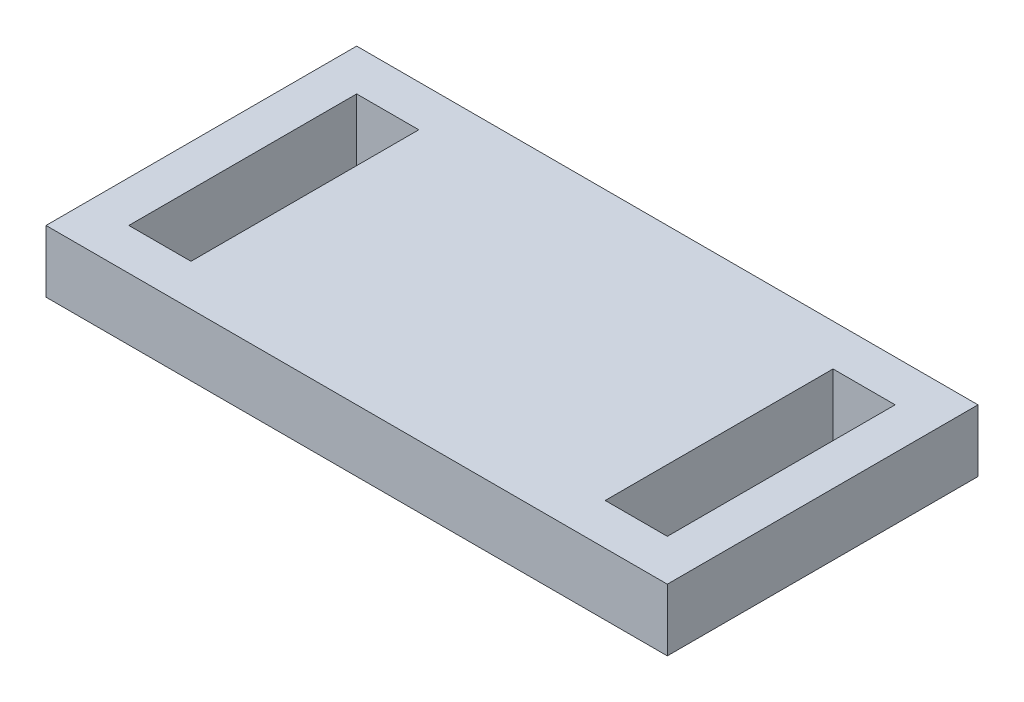
ISO-10303-21;
HEADER;
FILE_DESCRIPTION(('STEP AP214'),'2;1');
FILE_NAME('part.step','',(''),(''),'','','');
FILE_SCHEMA(('AUTOMOTIVE_DESIGN { 1 0 10303 214 1 1 1 1 }'));
ENDSEC;
DATA;
#1=APPLICATION_CONTEXT('core data for automotive mechanical design processes');
#2=APPLICATION_PROTOCOL_DEFINITION('international standard','automotive_design',2000,#1);
#3=PRODUCT_CONTEXT('',#1,'mechanical');
#4=PRODUCT('Part','Part','',(#3));
#5=PRODUCT_RELATED_PRODUCT_CATEGORY('part','',(#4));
#6=PRODUCT_DEFINITION_FORMATION('','',#4);
#7=PRODUCT_DEFINITION_CONTEXT('part definition',#1,'design');
#8=PRODUCT_DEFINITION('design','',#6,#7);
#9=PRODUCT_DEFINITION_SHAPE('','',#8);
#10=(LENGTH_UNIT() NAMED_UNIT(*) SI_UNIT(.MILLI.,.METRE.));
#11=(NAMED_UNIT(*) PLANE_ANGLE_UNIT() SI_UNIT($,.RADIAN.));
#12=(NAMED_UNIT(*) SI_UNIT($,.STERADIAN.) SOLID_ANGLE_UNIT());
#13=UNCERTAINTY_MEASURE_WITH_UNIT(LENGTH_MEASURE(1.E-05),#10,'distance_accuracy_value','');
#14=(GEOMETRIC_REPRESENTATION_CONTEXT(3) GLOBAL_UNCERTAINTY_ASSIGNED_CONTEXT((#13)) GLOBAL_UNIT_ASSIGNED_CONTEXT((#10,
#11,#12)) REPRESENTATION_CONTEXT('',''));
#15=CARTESIAN_POINT('',(0.,0.,0.));
#16=DIRECTION('',(0.,0.,1.));
#17=DIRECTION('',(1.,0.,0.));
#18=AXIS2_PLACEMENT_3D('',#15,#16,#17);
#19=CARTESIAN_POINT('',(15.,3.,-7.49999999999999));
#20=DIRECTION('',(-1.,0.,0.));
#21=DIRECTION('',(0.,0.,1.));
#22=AXIS2_PLACEMENT_3D('',#19,#20,#21);
#23=PLANE('',#22);
#24=DIRECTION('',(0.,0.,-1.));
#25=VECTOR('',#24,1.);
#26=CARTESIAN_POINT('',(15.,0.,-7.49999999999999));
#27=LINE('',#26,#25);
#28=CARTESIAN_POINT('',(15.,0.,7.5));
#29=VERTEX_POINT('',#28);
#30=CARTESIAN_POINT('',(15.,0.,-7.49999999999999));
#31=VERTEX_POINT('',#30);
#32=EDGE_CURVE('E186',#29,#31,#27,.T.);
#33=ORIENTED_EDGE('',*,*,#32,.T.);
#34=DIRECTION('',(0.,-1.,0.));
#35=VECTOR('',#34,1.);
#36=CARTESIAN_POINT('',(15.,3.,-7.49999999999999));
#37=LINE('',#36,#35);
#38=CARTESIAN_POINT('',(15.,3.,-7.49999999999999));
#39=VERTEX_POINT('',#38);
#40=EDGE_CURVE('E11',#39,#31,#37,.T.);
#41=ORIENTED_EDGE('',*,*,#40,.F.);
#42=DIRECTION('',(0.,0.,-1.));
#43=VECTOR('',#42,1.);
#44=CARTESIAN_POINT('',(15.,3.,-7.49999999999999));
#45=LINE('',#44,#43);
#46=CARTESIAN_POINT('',(15.,3.,7.5));
#47=VERTEX_POINT('',#46);
#48=EDGE_CURVE('E192',#47,#39,#45,.T.);
#49=ORIENTED_EDGE('',*,*,#48,.F.);
#50=DIRECTION('',(0.,-1.,0.));
#51=VECTOR('',#50,1.);
#52=CARTESIAN_POINT('',(15.,3.,7.5));
#53=LINE('',#52,#51);
#54=EDGE_CURVE('E204',#47,#29,#53,.T.);
#55=ORIENTED_EDGE('',*,*,#54,.T.);
#56=EDGE_LOOP('',(#33,#41,#49,#55));
#57=FACE_BOUND('',#56,.T.);
#58=ADVANCED_FACE('F36',(#57),#23,.F.);
#59=CARTESIAN_POINT('',(-15.,3.,-7.49999999999999));
#60=DIRECTION('',(0.,0.,1.));
#61=DIRECTION('',(1.,0.,0.));
#62=AXIS2_PLACEMENT_3D('',#59,#60,#61);
#63=PLANE('',#62);
#64=DIRECTION('',(-1.,0.,0.));
#65=VECTOR('',#64,1.);
#66=CARTESIAN_POINT('',(-14.9999999999999,0.,-7.49999999999999));
#67=LINE('',#66,#65);
#68=CARTESIAN_POINT('',(-14.9999999999999,0.,-7.49999999999999));
#69=VERTEX_POINT('',#68);
#70=EDGE_CURVE('E207',#31,#69,#67,.T.);
#71=ORIENTED_EDGE('',*,*,#70,.T.);
#72=DIRECTION('',(0.,-1.,0.));
#73=VECTOR('',#72,1.);
#74=CARTESIAN_POINT('',(-15.,3.,-7.49999999999999));
#75=LINE('',#74,#73);
#76=CARTESIAN_POINT('',(-15.,3.,-7.49999999999999));
#77=VERTEX_POINT('',#76);
#78=EDGE_CURVE('E43',#77,#69,#75,.T.);
#79=ORIENTED_EDGE('',*,*,#78,.F.);
#80=DIRECTION('',(-1.,0.,0.));
#81=VECTOR('',#80,1.);
#82=CARTESIAN_POINT('',(-15.,3.,-7.49999999999999));
#83=LINE('',#82,#81);
#84=EDGE_CURVE('E195',#39,#77,#83,.T.);
#85=ORIENTED_EDGE('',*,*,#84,.F.);
#86=ORIENTED_EDGE('',*,*,#40,.T.);
#87=EDGE_LOOP('',(#71,#79,#85,#86));
#88=FACE_BOUND('',#87,.T.);
#89=ADVANCED_FACE('F224',(#88),#63,.F.);
#90=CARTESIAN_POINT('',(-15.,3.,-7.49999999999999));
#91=DIRECTION('',(1.,0.,0.));
#92=DIRECTION('',(0.,0.,-1.));
#93=AXIS2_PLACEMENT_3D('',#90,#91,#92);
#94=PLANE('',#93);
#95=DIRECTION('',(0.,0.,1.));
#96=VECTOR('',#95,1.);
#97=CARTESIAN_POINT('',(-14.9999999999999,0.,-7.49999999999999));
#98=LINE('',#97,#96);
#99=CARTESIAN_POINT('',(-15.,0.,7.50000000000001));
#100=VERTEX_POINT('',#99);
#101=EDGE_CURVE('E210',#69,#100,#98,.T.);
#102=ORIENTED_EDGE('',*,*,#101,.T.);
#103=DIRECTION('',(0.,-1.,0.));
#104=VECTOR('',#103,1.);
#105=CARTESIAN_POINT('',(-15.,3.,7.50000000000002));
#106=LINE('',#105,#104);
#107=CARTESIAN_POINT('',(-15.,3.,7.50000000000002));
#108=VERTEX_POINT('',#107);
#109=EDGE_CURVE('E216',#108,#100,#106,.T.);
#110=ORIENTED_EDGE('',*,*,#109,.F.);
#111=DIRECTION('',(0.,0.,1.));
#112=VECTOR('',#111,1.);
#113=CARTESIAN_POINT('',(-15.,3.,-7.49999999999999));
#114=LINE('',#113,#112);
#115=EDGE_CURVE('E199',#77,#108,#114,.T.);
#116=ORIENTED_EDGE('',*,*,#115,.F.);
#117=ORIENTED_EDGE('',*,*,#78,.T.);
#118=EDGE_LOOP('',(#102,#110,#116,#117));
#119=FACE_BOUND('',#118,.T.);
#120=ADVANCED_FACE('F221',(#119),#94,.F.);
#121=CARTESIAN_POINT('',(-15.,3.,7.50000000000002));
#122=DIRECTION('',(0.,0.,-1.));
#123=DIRECTION('',(-1.,0.,0.));
#124=AXIS2_PLACEMENT_3D('',#121,#122,#123);
#125=PLANE('',#124);
#126=DIRECTION('',(1.,0.,0.));
#127=VECTOR('',#126,1.);
#128=CARTESIAN_POINT('',(-15.,0.,7.50000000000001));
#129=LINE('',#128,#127);
#130=EDGE_CURVE('E196',#100,#29,#129,.T.);
#131=ORIENTED_EDGE('',*,*,#130,.T.);
#132=ORIENTED_EDGE('',*,*,#54,.F.);
#133=DIRECTION('',(1.,0.,0.));
#134=VECTOR('',#133,1.);
#135=CARTESIAN_POINT('',(-15.,3.,7.50000000000002));
#136=LINE('',#135,#134);
#137=EDGE_CURVE('E202',#108,#47,#136,.T.);
#138=ORIENTED_EDGE('',*,*,#137,.F.);
#139=ORIENTED_EDGE('',*,*,#109,.T.);
#140=EDGE_LOOP('',(#131,#132,#138,#139));
#141=FACE_BOUND('',#140,.T.);
#142=ADVANCED_FACE('F230',(#141),#125,.F.);
#143=CARTESIAN_POINT('',(0.,3.,0.));
#144=DIRECTION('',(0.,1.,0.));
#145=DIRECTION('',(0.,0.,1.));
#146=AXIS2_PLACEMENT_3D('',#143,#144,#145);
#147=PLANE('',#146);
#148=DIRECTION('',(0.,0.,1.));
#149=VECTOR('',#148,1.);
#150=CARTESIAN_POINT('',(10.,3.,-5.50000000000001));
#151=LINE('',#150,#149);
#152=CARTESIAN_POINT('',(10.,3.,-5.50000000000001));
#153=VERTEX_POINT('',#152);
#154=CARTESIAN_POINT('',(9.99999999999999,3.,5.50000000000001));
#155=VERTEX_POINT('',#154);
#156=EDGE_CURVE('E128',#153,#155,#151,.T.);
#157=ORIENTED_EDGE('',*,*,#156,.F.);
#158=DIRECTION('',(-1.,0.,0.));
#159=VECTOR('',#158,1.);
#160=CARTESIAN_POINT('',(10.,3.,-5.50000000000001));
#161=LINE('',#160,#159);
#162=CARTESIAN_POINT('',(13.,3.,-5.49999999999999));
#163=VERTEX_POINT('',#162);
#164=EDGE_CURVE('E141',#163,#153,#161,.T.);
#165=ORIENTED_EDGE('',*,*,#164,.F.);
#166=DIRECTION('',(0.,0.,-1.));
#167=VECTOR('',#166,1.);
#168=CARTESIAN_POINT('',(13.,3.,-5.49999999999999));
#169=LINE('',#168,#167);
#170=CARTESIAN_POINT('',(13.,3.,5.50000000000001));
#171=VERTEX_POINT('',#170);
#172=EDGE_CURVE('E144',#171,#163,#169,.T.);
#173=ORIENTED_EDGE('',*,*,#172,.F.);
#174=DIRECTION('',(1.,0.,0.));
#175=VECTOR('',#174,1.);
#176=CARTESIAN_POINT('',(9.99999999999999,3.,5.50000000000001));
#177=LINE('',#176,#175);
#178=EDGE_CURVE('E150',#155,#171,#177,.T.);
#179=ORIENTED_EDGE('',*,*,#178,.F.);
#180=EDGE_LOOP('',(#157,#165,#173,#179));
#181=FACE_BOUND('',#180,.T.);
#182=DIRECTION('',(0.,0.,1.));
#183=VECTOR('',#182,1.);
#184=CARTESIAN_POINT('',(-13.,3.,-5.50000000000001));
#185=LINE('',#184,#183);
#186=CARTESIAN_POINT('',(-13.,3.,-5.50000000000001));
#187=VERTEX_POINT('',#186);
#188=CARTESIAN_POINT('',(-13.,3.,5.50000000000001));
#189=VERTEX_POINT('',#188);
#190=EDGE_CURVE('E156',#187,#189,#185,.T.);
#191=ORIENTED_EDGE('',*,*,#190,.F.);
#192=DIRECTION('',(-1.,0.,0.));
#193=VECTOR('',#192,1.);
#194=CARTESIAN_POINT('',(-13.,3.,-5.50000000000001));
#195=LINE('',#194,#193);
#196=CARTESIAN_POINT('',(-9.99999999999996,3.,-5.49999999999998));
#197=VERTEX_POINT('',#196);
#198=EDGE_CURVE('E164',#197,#187,#195,.T.);
#199=ORIENTED_EDGE('',*,*,#198,.F.);
#200=DIRECTION('',(0.,0.,-1.));
#201=VECTOR('',#200,1.);
#202=CARTESIAN_POINT('',(-9.99999999999996,3.,-5.49999999999998));
#203=LINE('',#202,#201);
#204=CARTESIAN_POINT('',(-10.,3.,5.50000000000001));
#205=VERTEX_POINT('',#204);
#206=EDGE_CURVE('E179',#205,#197,#203,.T.);
#207=ORIENTED_EDGE('',*,*,#206,.F.);
#208=DIRECTION('',(1.,0.,0.));
#209=VECTOR('',#208,1.);
#210=CARTESIAN_POINT('',(-13.,3.,5.50000000000001));
#211=LINE('',#210,#209);
#212=EDGE_CURVE('E176',#189,#205,#211,.T.);
#213=ORIENTED_EDGE('',*,*,#212,.F.);
#214=EDGE_LOOP('',(#191,#199,#207,#213));
#215=FACE_BOUND('',#214,.T.);
#216=ORIENTED_EDGE('',*,*,#48,.T.);
#217=ORIENTED_EDGE('',*,*,#84,.T.);
#218=ORIENTED_EDGE('',*,*,#115,.T.);
#219=ORIENTED_EDGE('',*,*,#137,.T.);
#220=EDGE_LOOP('',(#216,#217,#218,#219));
#221=FACE_BOUND('',#220,.T.);
#222=ADVANCED_FACE('F233',(#181,#215,#221),#147,.T.);
#223=CARTESIAN_POINT('',(0.,0.,0.));
#224=DIRECTION('',(0.,1.,0.));
#225=DIRECTION('',(0.,0.,1.));
#226=AXIS2_PLACEMENT_3D('',#223,#224,#225);
#227=PLANE('',#226);
#228=DIRECTION('',(-1.,0.,0.));
#229=VECTOR('',#228,1.);
#230=CARTESIAN_POINT('',(10.,0.,-5.49999999999999));
#231=LINE('',#230,#229);
#232=CARTESIAN_POINT('',(13.,0.,-5.49999999999999));
#233=VERTEX_POINT('',#232);
#234=CARTESIAN_POINT('',(10.,0.,-5.49999999999999));
#235=VERTEX_POINT('',#234);
#236=EDGE_CURVE('E129',#233,#235,#231,.T.);
#237=ORIENTED_EDGE('',*,*,#236,.T.);
#238=DIRECTION('',(0.,0.,1.));
#239=VECTOR('',#238,1.);
#240=CARTESIAN_POINT('',(10.,0.,-5.49999999999999));
#241=LINE('',#240,#239);
#242=CARTESIAN_POINT('',(10.,0.,5.50000000000001));
#243=VERTEX_POINT('',#242);
#244=EDGE_CURVE('E125',#235,#243,#241,.T.);
#245=ORIENTED_EDGE('',*,*,#244,.T.);
#246=DIRECTION('',(1.,0.,0.));
#247=VECTOR('',#246,1.);
#248=CARTESIAN_POINT('',(10.,0.,5.50000000000001));
#249=LINE('',#248,#247);
#250=CARTESIAN_POINT('',(13.,0.,5.49999999999999));
#251=VERTEX_POINT('',#250);
#252=EDGE_CURVE('E132',#243,#251,#249,.T.);
#253=ORIENTED_EDGE('',*,*,#252,.T.);
#254=DIRECTION('',(0.,0.,-1.));
#255=VECTOR('',#254,1.);
#256=CARTESIAN_POINT('',(13.,0.,-5.49999999999999));
#257=LINE('',#256,#255);
#258=EDGE_CURVE('E136',#251,#233,#257,.T.);
#259=ORIENTED_EDGE('',*,*,#258,.T.);
#260=EDGE_LOOP('',(#237,#245,#253,#259));
#261=FACE_BOUND('',#260,.T.);
#262=DIRECTION('',(-1.,0.,0.));
#263=VECTOR('',#262,1.);
#264=CARTESIAN_POINT('',(-13.,0.,-5.50000000000001));
#265=LINE('',#264,#263);
#266=CARTESIAN_POINT('',(-9.99999999999996,0.,-5.49999999999999));
#267=VERTEX_POINT('',#266);
#268=CARTESIAN_POINT('',(-13.,0.,-5.50000000000001));
#269=VERTEX_POINT('',#268);
#270=EDGE_CURVE('E170',#267,#269,#265,.T.);
#271=ORIENTED_EDGE('',*,*,#270,.T.);
#272=DIRECTION('',(0.,0.,1.));
#273=VECTOR('',#272,1.);
#274=CARTESIAN_POINT('',(-13.,0.,-5.50000000000001));
#275=LINE('',#274,#273);
#276=CARTESIAN_POINT('',(-13.,0.,5.50000000000002));
#277=VERTEX_POINT('',#276);
#278=EDGE_CURVE('E160',#269,#277,#275,.T.);
#279=ORIENTED_EDGE('',*,*,#278,.T.);
#280=DIRECTION('',(1.,0.,0.));
#281=VECTOR('',#280,1.);
#282=CARTESIAN_POINT('',(-13.,0.,5.50000000000002));
#283=LINE('',#282,#281);
#284=CARTESIAN_POINT('',(-10.,0.,5.50000000000001));
#285=VERTEX_POINT('',#284);
#286=EDGE_CURVE('E163',#277,#285,#283,.T.);
#287=ORIENTED_EDGE('',*,*,#286,.T.);
#288=DIRECTION('',(0.,0.,-1.));
#289=VECTOR('',#288,1.);
#290=CARTESIAN_POINT('',(-9.99999999999996,0.,-5.49999999999999));
#291=LINE('',#290,#289);
#292=EDGE_CURVE('E167',#285,#267,#291,.T.);
#293=ORIENTED_EDGE('',*,*,#292,.T.);
#294=EDGE_LOOP('',(#271,#279,#287,#293));
#295=FACE_BOUND('',#294,.T.);
#296=ORIENTED_EDGE('',*,*,#32,.F.);
#297=ORIENTED_EDGE('',*,*,#130,.F.);
#298=ORIENTED_EDGE('',*,*,#101,.F.);
#299=ORIENTED_EDGE('',*,*,#70,.F.);
#300=EDGE_LOOP('',(#296,#297,#298,#299));
#301=FACE_BOUND('',#300,.T.);
#302=ADVANCED_FACE('F138',(#261,#295,#301),#227,.F.);
#303=CARTESIAN_POINT('',(-13.,0.,-5.50000000000001));
#304=DIRECTION('',(-1.,0.,0.));
#305=DIRECTION('',(0.,0.,1.));
#306=AXIS2_PLACEMENT_3D('',#303,#304,#305);
#307=PLANE('',#306);
#308=ORIENTED_EDGE('',*,*,#190,.T.);
#309=DIRECTION('',(0.,1.,0.));
#310=VECTOR('',#309,1.);
#311=CARTESIAN_POINT('',(-13.,0.,5.50000000000002));
#312=LINE('',#311,#310);
#313=EDGE_CURVE('E173',#277,#189,#312,.T.);
#314=ORIENTED_EDGE('',*,*,#313,.F.);
#315=ORIENTED_EDGE('',*,*,#278,.F.);
#316=DIRECTION('',(0.,1.,0.));
#317=VECTOR('',#316,1.);
#318=CARTESIAN_POINT('',(-13.,0.,-5.50000000000001));
#319=LINE('',#318,#317);
#320=EDGE_CURVE('E184',#269,#187,#319,.T.);
#321=ORIENTED_EDGE('',*,*,#320,.T.);
#322=EDGE_LOOP('',(#308,#314,#315,#321));
#323=FACE_BOUND('',#322,.T.);
#324=ADVANCED_FACE('F248',(#323),#307,.F.);
#325=CARTESIAN_POINT('',(-13.,0.,-5.50000000000001));
#326=DIRECTION('',(0.,0.,-1.));
#327=DIRECTION('',(-1.,0.,0.));
#328=AXIS2_PLACEMENT_3D('',#325,#326,#327);
#329=PLANE('',#328);
#330=ORIENTED_EDGE('',*,*,#198,.T.);
#331=ORIENTED_EDGE('',*,*,#320,.F.);
#332=ORIENTED_EDGE('',*,*,#270,.F.);
#333=DIRECTION('',(0.,1.,0.));
#334=VECTOR('',#333,1.);
#335=CARTESIAN_POINT('',(-9.99999999999996,0.,-5.49999999999999));
#336=LINE('',#335,#334);
#337=EDGE_CURVE('E187',#267,#197,#336,.T.);
#338=ORIENTED_EDGE('',*,*,#337,.T.);
#339=EDGE_LOOP('',(#330,#331,#332,#338));
#340=FACE_BOUND('',#339,.T.);
#341=ADVANCED_FACE('F254',(#340),#329,.F.);
#342=CARTESIAN_POINT('',(-9.99999999999996,0.,-5.49999999999999));
#343=DIRECTION('',(1.,0.,0.));
#344=DIRECTION('',(0.,0.,-1.));
#345=AXIS2_PLACEMENT_3D('',#342,#343,#344);
#346=PLANE('',#345);
#347=ORIENTED_EDGE('',*,*,#206,.T.);
#348=ORIENTED_EDGE('',*,*,#337,.F.);
#349=ORIENTED_EDGE('',*,*,#292,.F.);
#350=DIRECTION('',(0.,1.,0.));
#351=VECTOR('',#350,1.);
#352=CARTESIAN_POINT('',(-10.,0.,5.50000000000001));
#353=LINE('',#352,#351);
#354=EDGE_CURVE('E189',#285,#205,#353,.T.);
#355=ORIENTED_EDGE('',*,*,#354,.T.);
#356=EDGE_LOOP('',(#347,#348,#349,#355));
#357=FACE_BOUND('',#356,.T.);
#358=ADVANCED_FACE('F259',(#357),#346,.F.);
#359=CARTESIAN_POINT('',(-13.,0.,5.50000000000002));
#360=DIRECTION('',(0.,0.,1.));
#361=DIRECTION('',(1.,0.,0.));
#362=AXIS2_PLACEMENT_3D('',#359,#360,#361);
#363=PLANE('',#362);
#364=ORIENTED_EDGE('',*,*,#212,.T.);
#365=ORIENTED_EDGE('',*,*,#354,.F.);
#366=ORIENTED_EDGE('',*,*,#286,.F.);
#367=ORIENTED_EDGE('',*,*,#313,.T.);
#368=EDGE_LOOP('',(#364,#365,#366,#367));
#369=FACE_BOUND('',#368,.T.);
#370=ADVANCED_FACE('F256',(#369),#363,.F.);
#371=CARTESIAN_POINT('',(10.,0.,-5.49999999999999));
#372=DIRECTION('',(-1.,0.,0.));
#373=DIRECTION('',(0.,0.,1.));
#374=AXIS2_PLACEMENT_3D('',#371,#372,#373);
#375=PLANE('',#374);
#376=ORIENTED_EDGE('',*,*,#156,.T.);
#377=DIRECTION('',(0.,1.,0.));
#378=VECTOR('',#377,1.);
#379=CARTESIAN_POINT('',(10.,0.,5.50000000000001));
#380=LINE('',#379,#378);
#381=EDGE_CURVE('E50',#243,#155,#380,.T.);
#382=ORIENTED_EDGE('',*,*,#381,.F.);
#383=ORIENTED_EDGE('',*,*,#244,.F.);
#384=DIRECTION('',(0.,1.,0.));
#385=VECTOR('',#384,1.);
#386=CARTESIAN_POINT('',(10.,0.,-5.49999999999999));
#387=LINE('',#386,#385);
#388=EDGE_CURVE('E154',#235,#153,#387,.T.);
#389=ORIENTED_EDGE('',*,*,#388,.T.);
#390=EDGE_LOOP('',(#376,#382,#383,#389));
#391=FACE_BOUND('',#390,.T.);
#392=ADVANCED_FACE('F123',(#391),#375,.F.);
#393=CARTESIAN_POINT('',(10.,0.,-5.49999999999999));
#394=DIRECTION('',(0.,0.,-1.));
#395=DIRECTION('',(-1.,0.,0.));
#396=AXIS2_PLACEMENT_3D('',#393,#394,#395);
#397=PLANE('',#396);
#398=ORIENTED_EDGE('',*,*,#164,.T.);
#399=ORIENTED_EDGE('',*,*,#388,.F.);
#400=ORIENTED_EDGE('',*,*,#236,.F.);
#401=DIRECTION('',(0.,1.,0.));
#402=VECTOR('',#401,1.);
#403=CARTESIAN_POINT('',(13.,0.,-5.49999999999999));
#404=LINE('',#403,#402);
#405=EDGE_CURVE('E157',#233,#163,#404,.T.);
#406=ORIENTED_EDGE('',*,*,#405,.T.);
#407=EDGE_LOOP('',(#398,#399,#400,#406));
#408=FACE_BOUND('',#407,.T.);
#409=ADVANCED_FACE('F269',(#408),#397,.F.);
#410=CARTESIAN_POINT('',(13.,0.,-5.49999999999999));
#411=DIRECTION('',(1.,0.,0.));
#412=DIRECTION('',(0.,0.,-1.));
#413=AXIS2_PLACEMENT_3D('',#410,#411,#412);
#414=PLANE('',#413);
#415=ORIENTED_EDGE('',*,*,#172,.T.);
#416=ORIENTED_EDGE('',*,*,#405,.F.);
#417=ORIENTED_EDGE('',*,*,#258,.F.);
#418=DIRECTION('',(0.,1.,0.));
#419=VECTOR('',#418,1.);
#420=CARTESIAN_POINT('',(13.,0.,5.49999999999999));
#421=LINE('',#420,#419);
#422=EDGE_CURVE('E55',#251,#171,#421,.T.);
#423=ORIENTED_EDGE('',*,*,#422,.T.);
#424=EDGE_LOOP('',(#415,#416,#417,#423));
#425=FACE_BOUND('',#424,.T.);
#426=ADVANCED_FACE('F272',(#425),#414,.F.);
#427=CARTESIAN_POINT('',(10.,0.,5.50000000000001));
#428=DIRECTION('',(0.,0.,1.));
#429=DIRECTION('',(1.,0.,0.));
#430=AXIS2_PLACEMENT_3D('',#427,#428,#429);
#431=PLANE('',#430);
#432=ORIENTED_EDGE('',*,*,#178,.T.);
#433=ORIENTED_EDGE('',*,*,#422,.F.);
#434=ORIENTED_EDGE('',*,*,#252,.F.);
#435=ORIENTED_EDGE('',*,*,#381,.T.);
#436=EDGE_LOOP('',(#432,#433,#434,#435));
#437=FACE_BOUND('',#436,.T.);
#438=ADVANCED_FACE('F133',(#437),#431,.F.);
#439=CLOSED_SHELL('',(#58,#89,#120,#142,#222,#302,#324,#341,#358,#370,#392,#409,#426,#438));
#440=MANIFOLD_SOLID_BREP('B2',#439);
#441=ADVANCED_BREP_SHAPE_REPRESENTATION('',(#18,#440),#14);
#442=SHAPE_DEFINITION_REPRESENTATION(#9,#441);
ENDSEC;
END-ISO-10303-21;
